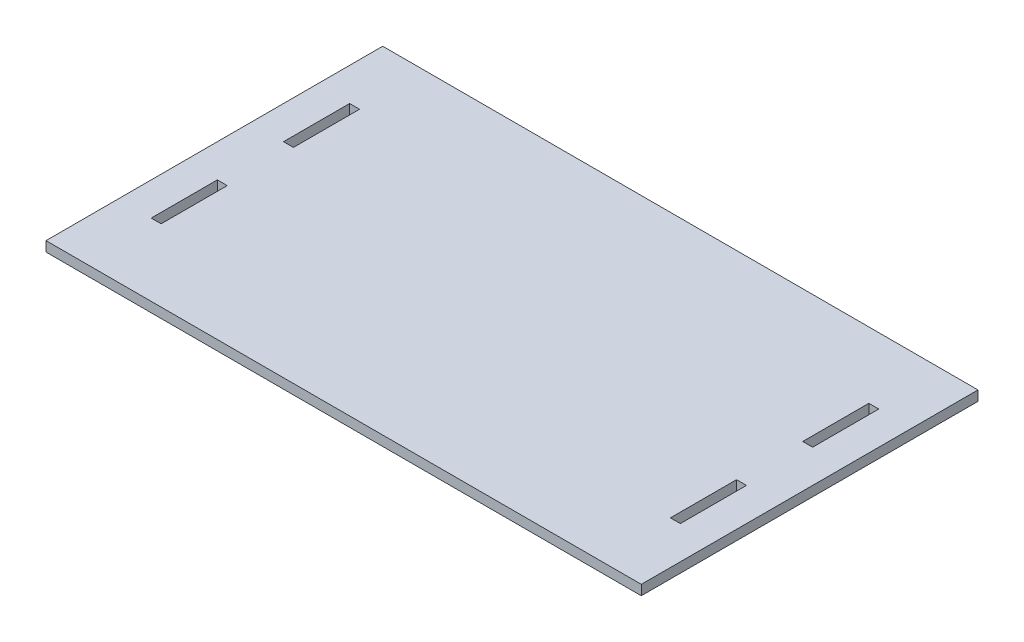
ISO-10303-21;
HEADER;
FILE_DESCRIPTION(('STEP AP214'),'2;1');
FILE_NAME('part.step','',(''),(''),'','','');
FILE_SCHEMA(('AUTOMOTIVE_DESIGN { 1 0 10303 214 1 1 1 1 }'));
ENDSEC;
DATA;
#1=APPLICATION_CONTEXT('core data for automotive mechanical design processes');
#2=APPLICATION_PROTOCOL_DEFINITION('international standard','automotive_design',2000,#1);
#3=PRODUCT_CONTEXT('',#1,'mechanical');
#4=PRODUCT('Part','Part','',(#3));
#5=PRODUCT_RELATED_PRODUCT_CATEGORY('part','',(#4));
#6=PRODUCT_DEFINITION_FORMATION('','',#4);
#7=PRODUCT_DEFINITION_CONTEXT('part definition',#1,'design');
#8=PRODUCT_DEFINITION('design','',#6,#7);
#9=PRODUCT_DEFINITION_SHAPE('','',#8);
#10=(LENGTH_UNIT() NAMED_UNIT(*) SI_UNIT(.MILLI.,.METRE.));
#11=(NAMED_UNIT(*) PLANE_ANGLE_UNIT() SI_UNIT($,.RADIAN.));
#12=(NAMED_UNIT(*) SI_UNIT($,.STERADIAN.) SOLID_ANGLE_UNIT());
#13=UNCERTAINTY_MEASURE_WITH_UNIT(LENGTH_MEASURE(1.E-05),#10,'distance_accuracy_value','');
#14=(GEOMETRIC_REPRESENTATION_CONTEXT(3) GLOBAL_UNCERTAINTY_ASSIGNED_CONTEXT((#13)) GLOBAL_UNIT_ASSIGNED_CONTEXT((#10,
#11,#12)) REPRESENTATION_CONTEXT('',''));
#15=CARTESIAN_POINT('',(0.,0.,0.));
#16=DIRECTION('',(0.,0.,1.));
#17=DIRECTION('',(1.,0.,0.));
#18=AXIS2_PLACEMENT_3D('',#15,#16,#17);
#19=CARTESIAN_POINT('',(0.,3.,0.));
#20=DIRECTION('',(1.,0.,0.));
#21=DIRECTION('',(0.,0.,-1.));
#22=AXIS2_PLACEMENT_3D('',#19,#20,#21);
#23=PLANE('',#22);
#24=DIRECTION('',(0.,0.,1.));
#25=VECTOR('',#24,1.);
#26=CARTESIAN_POINT('',(0.,0.,0.));
#27=LINE('',#26,#25);
#28=CARTESIAN_POINT('',(0.,0.,-101.81));
#29=VERTEX_POINT('',#28);
#30=CARTESIAN_POINT('',(0.,0.,0.));
#31=VERTEX_POINT('',#30);
#32=EDGE_CURVE('E298',#29,#31,#27,.T.);
#33=ORIENTED_EDGE('',*,*,#32,.T.);
#34=DIRECTION('',(0.,-1.,0.));
#35=VECTOR('',#34,1.);
#36=CARTESIAN_POINT('',(0.,3.,0.));
#37=LINE('',#36,#35);
#38=CARTESIAN_POINT('',(0.,3.,0.));
#39=VERTEX_POINT('',#38);
#40=EDGE_CURVE('E11',#39,#31,#37,.T.);
#41=ORIENTED_EDGE('',*,*,#40,.F.);
#42=DIRECTION('',(0.,0.,1.));
#43=VECTOR('',#42,1.);
#44=CARTESIAN_POINT('',(0.,3.,0.));
#45=LINE('',#44,#43);
#46=CARTESIAN_POINT('',(0.,3.,-101.81));
#47=VERTEX_POINT('',#46);
#48=EDGE_CURVE('E305',#47,#39,#45,.T.);
#49=ORIENTED_EDGE('',*,*,#48,.F.);
#50=DIRECTION('',(0.,-1.,0.));
#51=VECTOR('',#50,1.);
#52=CARTESIAN_POINT('',(0.,3.,-101.81));
#53=LINE('',#52,#51);
#54=EDGE_CURVE('E315',#47,#29,#53,.T.);
#55=ORIENTED_EDGE('',*,*,#54,.T.);
#56=EDGE_LOOP('',(#33,#41,#49,#55));
#57=FACE_BOUND('',#56,.T.);
#58=ADVANCED_FACE('F33',(#57),#23,.F.);
#59=CARTESIAN_POINT('',(0.,3.,0.));
#60=DIRECTION('',(0.,0.,-1.));
#61=DIRECTION('',(-1.,0.,0.));
#62=AXIS2_PLACEMENT_3D('',#59,#60,#61);
#63=PLANE('',#62);
#64=DIRECTION('',(1.,0.,0.));
#65=VECTOR('',#64,1.);
#66=CARTESIAN_POINT('',(0.,0.,0.));
#67=LINE('',#66,#65);
#68=CARTESIAN_POINT('',(180.,0.,0.));
#69=VERTEX_POINT('',#68);
#70=EDGE_CURVE('E318',#31,#69,#67,.T.);
#71=ORIENTED_EDGE('',*,*,#70,.T.);
#72=DIRECTION('',(0.,-1.,0.));
#73=VECTOR('',#72,1.);
#74=CARTESIAN_POINT('',(180.,3.,0.));
#75=LINE('',#74,#73);
#76=CARTESIAN_POINT('',(180.,3.,0.));
#77=VERTEX_POINT('',#76);
#78=EDGE_CURVE('E40',#77,#69,#75,.T.);
#79=ORIENTED_EDGE('',*,*,#78,.F.);
#80=DIRECTION('',(1.,0.,0.));
#81=VECTOR('',#80,1.);
#82=CARTESIAN_POINT('',(0.,3.,0.));
#83=LINE('',#82,#81);
#84=EDGE_CURVE('E308',#39,#77,#83,.T.);
#85=ORIENTED_EDGE('',*,*,#84,.F.);
#86=ORIENTED_EDGE('',*,*,#40,.T.);
#87=EDGE_LOOP('',(#71,#79,#85,#86));
#88=FACE_BOUND('',#87,.T.);
#89=ADVANCED_FACE('F347',(#88),#63,.F.);
#90=CARTESIAN_POINT('',(180.,3.,0.));
#91=DIRECTION('',(-1.,0.,0.));
#92=DIRECTION('',(0.,0.,1.));
#93=AXIS2_PLACEMENT_3D('',#90,#91,#92);
#94=PLANE('',#93);
#95=DIRECTION('',(0.,0.,-1.));
#96=VECTOR('',#95,1.);
#97=CARTESIAN_POINT('',(180.,0.,0.));
#98=LINE('',#97,#96);
#99=CARTESIAN_POINT('',(180.,0.,-101.81));
#100=VERTEX_POINT('',#99);
#101=EDGE_CURVE('E320',#69,#100,#98,.T.);
#102=ORIENTED_EDGE('',*,*,#101,.T.);
#103=DIRECTION('',(0.,-1.,0.));
#104=VECTOR('',#103,1.);
#105=CARTESIAN_POINT('',(180.,3.,-101.81));
#106=LINE('',#105,#104);
#107=CARTESIAN_POINT('',(180.,3.,-101.81));
#108=VERTEX_POINT('',#107);
#109=EDGE_CURVE('E325',#108,#100,#106,.T.);
#110=ORIENTED_EDGE('',*,*,#109,.F.);
#111=DIRECTION('',(0.,0.,-1.));
#112=VECTOR('',#111,1.);
#113=CARTESIAN_POINT('',(180.,3.,0.));
#114=LINE('',#113,#112);
#115=EDGE_CURVE('E311',#77,#108,#114,.T.);
#116=ORIENTED_EDGE('',*,*,#115,.F.);
#117=ORIENTED_EDGE('',*,*,#78,.T.);
#118=EDGE_LOOP('',(#102,#110,#116,#117));
#119=FACE_BOUND('',#118,.T.);
#120=ADVANCED_FACE('F332',(#119),#94,.F.);
#121=CARTESIAN_POINT('',(0.,3.,-101.81));
#122=DIRECTION('',(0.,0.,1.));
#123=DIRECTION('',(1.,0.,0.));
#124=AXIS2_PLACEMENT_3D('',#121,#122,#123);
#125=PLANE('',#124);
#126=DIRECTION('',(-1.,0.,0.));
#127=VECTOR('',#126,1.);
#128=CARTESIAN_POINT('',(0.,0.,-101.81));
#129=LINE('',#128,#127);
#130=EDGE_CURVE('E309',#100,#29,#129,.T.);
#131=ORIENTED_EDGE('',*,*,#130,.T.);
#132=ORIENTED_EDGE('',*,*,#54,.F.);
#133=DIRECTION('',(-1.,0.,0.));
#134=VECTOR('',#133,1.);
#135=CARTESIAN_POINT('',(0.,3.,-101.81));
#136=LINE('',#135,#134);
#137=EDGE_CURVE('E313',#108,#47,#136,.T.);
#138=ORIENTED_EDGE('',*,*,#137,.F.);
#139=ORIENTED_EDGE('',*,*,#109,.T.);
#140=EDGE_LOOP('',(#131,#132,#138,#139));
#141=FACE_BOUND('',#140,.T.);
#142=ADVANCED_FACE('F340',(#141),#125,.F.);
#143=CARTESIAN_POINT('',(0.,3.,0.));
#144=DIRECTION('',(0.,-1.,0.));
#145=DIRECTION('',(0.,0.,-1.));
#146=AXIS2_PLACEMENT_3D('',#143,#144,#145);
#147=PLANE('',#146);
#148=DIRECTION('',(1.,0.,0.));
#149=VECTOR('',#148,1.);
#150=CARTESIAN_POINT('',(9.99999999999979,3.,-21.8066157200849));
#151=LINE('',#150,#149);
#152=CARTESIAN_POINT('',(9.99999999999979,3.,-21.8066157200849));
#153=VERTEX_POINT('',#152);
#154=CARTESIAN_POINT('',(12.9999999999998,3.,-21.8066157200849));
#155=VERTEX_POINT('',#154);
#156=EDGE_CURVE('E227',#153,#155,#151,.T.);
#157=ORIENTED_EDGE('',*,*,#156,.F.);
#158=DIRECTION('',(0.,0.,1.));
#159=VECTOR('',#158,1.);
#160=CARTESIAN_POINT('',(9.99999999999979,3.,-41.8066157200849));
#161=LINE('',#160,#159);
#162=CARTESIAN_POINT('',(9.99999999999979,3.,-41.8066157200849));
#163=VERTEX_POINT('',#162);
#164=EDGE_CURVE('E47',#163,#153,#161,.T.);
#165=ORIENTED_EDGE('',*,*,#164,.F.);
#166=DIRECTION('',(-1.,0.,0.));
#167=VECTOR('',#166,1.);
#168=CARTESIAN_POINT('',(9.99999999999979,3.,-41.8066157200849));
#169=LINE('',#168,#167);
#170=CARTESIAN_POINT('',(12.9999999999998,3.,-41.8066157200849));
#171=VERTEX_POINT('',#170);
#172=EDGE_CURVE('E216',#171,#163,#169,.T.);
#173=ORIENTED_EDGE('',*,*,#172,.F.);
#174=DIRECTION('',(0.,0.,-1.));
#175=VECTOR('',#174,1.);
#176=CARTESIAN_POINT('',(12.9999999999998,3.,-41.8066157200849));
#177=LINE('',#176,#175);
#178=EDGE_CURVE('E231',#155,#171,#177,.T.);
#179=ORIENTED_EDGE('',*,*,#178,.F.);
#180=EDGE_LOOP('',(#157,#165,#173,#179));
#181=FACE_BOUND('',#180,.T.);
#182=DIRECTION('',(1.,0.,0.));
#183=VECTOR('',#182,1.);
#184=CARTESIAN_POINT('',(167.,3.,-61.8066157200849));
#185=LINE('',#184,#183);
#186=CARTESIAN_POINT('',(167.,3.,-61.8066157200849));
#187=VERTEX_POINT('',#186);
#188=CARTESIAN_POINT('',(170.,3.,-61.8066157200849));
#189=VERTEX_POINT('',#188);
#190=EDGE_CURVE('E259',#187,#189,#185,.T.);
#191=ORIENTED_EDGE('',*,*,#190,.F.);
#192=DIRECTION('',(0.,0.,1.));
#193=VECTOR('',#192,1.);
#194=CARTESIAN_POINT('',(167.,3.,-81.8066157200849));
#195=LINE('',#194,#193);
#196=CARTESIAN_POINT('',(167.,3.,-81.8066157200849));
#197=VERTEX_POINT('',#196);
#198=EDGE_CURVE('E55',#197,#187,#195,.T.);
#199=ORIENTED_EDGE('',*,*,#198,.F.);
#200=DIRECTION('',(-1.,0.,0.));
#201=VECTOR('',#200,1.);
#202=CARTESIAN_POINT('',(167.,3.,-81.8066157200849));
#203=LINE('',#202,#201);
#204=CARTESIAN_POINT('',(170.,3.,-81.8066157200849));
#205=VERTEX_POINT('',#204);
#206=EDGE_CURVE('E248',#205,#197,#203,.T.);
#207=ORIENTED_EDGE('',*,*,#206,.F.);
#208=DIRECTION('',(0.,0.,-1.));
#209=VECTOR('',#208,1.);
#210=CARTESIAN_POINT('',(170.,3.,-81.8066157200849));
#211=LINE('',#210,#209);
#212=EDGE_CURVE('E262',#189,#205,#211,.T.);
#213=ORIENTED_EDGE('',*,*,#212,.F.);
#214=EDGE_LOOP('',(#191,#199,#207,#213));
#215=FACE_BOUND('',#214,.T.);
#216=DIRECTION('',(1.,0.,0.));
#217=VECTOR('',#216,1.);
#218=CARTESIAN_POINT('',(167.,3.,-21.8066157200849));
#219=LINE('',#218,#217);
#220=CARTESIAN_POINT('',(167.,3.,-21.8066157200849));
#221=VERTEX_POINT('',#220);
#222=CARTESIAN_POINT('',(170.,3.,-21.8066157200849));
#223=VERTEX_POINT('',#222);
#224=EDGE_CURVE('E203',#221,#223,#219,.T.);
#225=ORIENTED_EDGE('',*,*,#224,.F.);
#226=DIRECTION('',(0.,0.,1.));
#227=VECTOR('',#226,1.);
#228=CARTESIAN_POINT('',(167.,3.,-41.8066157200849));
#229=LINE('',#228,#227);
#230=CARTESIAN_POINT('',(167.,3.,-41.8066157200849));
#231=VERTEX_POINT('',#230);
#232=EDGE_CURVE('E176',#231,#221,#229,.T.);
#233=ORIENTED_EDGE('',*,*,#232,.F.);
#234=DIRECTION('',(-1.,0.,0.));
#235=VECTOR('',#234,1.);
#236=CARTESIAN_POINT('',(167.,3.,-41.8066157200849));
#237=LINE('',#236,#235);
#238=CARTESIAN_POINT('',(170.,3.,-41.8066157200849));
#239=VERTEX_POINT('',#238);
#240=EDGE_CURVE('E194',#239,#231,#237,.T.);
#241=ORIENTED_EDGE('',*,*,#240,.F.);
#242=DIRECTION('',(0.,0.,-1.));
#243=VECTOR('',#242,1.);
#244=CARTESIAN_POINT('',(170.,3.,-41.8066157200849));
#245=LINE('',#244,#243);
#246=EDGE_CURVE('E197',#223,#239,#245,.T.);
#247=ORIENTED_EDGE('',*,*,#246,.F.);
#248=EDGE_LOOP('',(#225,#233,#241,#247));
#249=FACE_BOUND('',#248,.T.);
#250=DIRECTION('',(1.,0.,0.));
#251=VECTOR('',#250,1.);
#252=CARTESIAN_POINT('',(9.99999999999979,3.,-61.8066157200849));
#253=LINE('',#252,#251);
#254=CARTESIAN_POINT('',(9.99999999999979,3.,-61.8066157200849));
#255=VERTEX_POINT('',#254);
#256=CARTESIAN_POINT('',(12.9999999999998,3.,-61.8066157200849));
#257=VERTEX_POINT('',#256);
#258=EDGE_CURVE('E288',#255,#257,#253,.T.);
#259=ORIENTED_EDGE('',*,*,#258,.F.);
#260=DIRECTION('',(0.,0.,1.));
#261=VECTOR('',#260,1.);
#262=CARTESIAN_POINT('',(9.99999999999979,3.,-81.8066157200849));
#263=LINE('',#262,#261);
#264=CARTESIAN_POINT('',(9.99999999999979,3.,-81.8066157200849));
#265=VERTEX_POINT('',#264);
#266=EDGE_CURVE('E238',#265,#255,#263,.T.);
#267=ORIENTED_EDGE('',*,*,#266,.F.);
#268=DIRECTION('',(-1.,0.,0.));
#269=VECTOR('',#268,1.);
#270=CARTESIAN_POINT('',(9.99999999999979,3.,-81.8066157200849));
#271=LINE('',#270,#269);
#272=CARTESIAN_POINT('',(12.9999999999998,3.,-81.8066157200849));
#273=VERTEX_POINT('',#272);
#274=EDGE_CURVE('E277',#273,#265,#271,.T.);
#275=ORIENTED_EDGE('',*,*,#274,.F.);
#276=DIRECTION('',(0.,0.,-1.));
#277=VECTOR('',#276,1.);
#278=CARTESIAN_POINT('',(12.9999999999998,3.,-81.8066157200849));
#279=LINE('',#278,#277);
#280=EDGE_CURVE('E291',#257,#273,#279,.T.);
#281=ORIENTED_EDGE('',*,*,#280,.F.);
#282=EDGE_LOOP('',(#259,#267,#275,#281));
#283=FACE_BOUND('',#282,.T.);
#284=ORIENTED_EDGE('',*,*,#48,.T.);
#285=ORIENTED_EDGE('',*,*,#84,.T.);
#286=ORIENTED_EDGE('',*,*,#115,.T.);
#287=ORIENTED_EDGE('',*,*,#137,.T.);
#288=EDGE_LOOP('',(#284,#285,#286,#287));
#289=FACE_BOUND('',#288,.T.);
#290=ADVANCED_FACE('F346',(#181,#215,#249,#283,#289),#147,.F.);
#291=CARTESIAN_POINT('',(0.,0.,0.));
#292=DIRECTION('',(0.,-1.,0.));
#293=DIRECTION('',(0.,0.,-1.));
#294=AXIS2_PLACEMENT_3D('',#291,#292,#293);
#295=PLANE('',#294);
#296=DIRECTION('',(0.,0.,1.));
#297=VECTOR('',#296,1.);
#298=CARTESIAN_POINT('',(9.99999999999979,0.,-41.8066157200849));
#299=LINE('',#298,#297);
#300=CARTESIAN_POINT('',(9.99999999999979,0.,-41.8066157200849));
#301=VERTEX_POINT('',#300);
#302=CARTESIAN_POINT('',(9.99999999999979,0.,-21.8066157200849));
#303=VERTEX_POINT('',#302);
#304=EDGE_CURVE('E212',#301,#303,#299,.T.);
#305=ORIENTED_EDGE('',*,*,#304,.T.);
#306=DIRECTION('',(1.,0.,0.));
#307=VECTOR('',#306,1.);
#308=CARTESIAN_POINT('',(9.99999999999979,0.,-21.8066157200849));
#309=LINE('',#308,#307);
#310=CARTESIAN_POINT('',(12.9999999999998,0.,-21.8066157200849));
#311=VERTEX_POINT('',#310);
#312=EDGE_CURVE('E215',#303,#311,#309,.T.);
#313=ORIENTED_EDGE('',*,*,#312,.T.);
#314=DIRECTION('',(0.,0.,-1.));
#315=VECTOR('',#314,1.);
#316=CARTESIAN_POINT('',(12.9999999999998,0.,-41.8066157200849));
#317=LINE('',#316,#315);
#318=CARTESIAN_POINT('',(12.9999999999998,0.,-41.8066157200849));
#319=VERTEX_POINT('',#318);
#320=EDGE_CURVE('E219',#311,#319,#317,.T.);
#321=ORIENTED_EDGE('',*,*,#320,.T.);
#322=DIRECTION('',(-1.,0.,0.));
#323=VECTOR('',#322,1.);
#324=CARTESIAN_POINT('',(9.99999999999979,0.,-41.8066157200849));
#325=LINE('',#324,#323);
#326=EDGE_CURVE('E222',#319,#301,#325,.T.);
#327=ORIENTED_EDGE('',*,*,#326,.T.);
#328=EDGE_LOOP('',(#305,#313,#321,#327));
#329=FACE_BOUND('',#328,.T.);
#330=DIRECTION('',(0.,0.,1.));
#331=VECTOR('',#330,1.);
#332=CARTESIAN_POINT('',(167.,0.,-81.8066157200849));
#333=LINE('',#332,#331);
#334=CARTESIAN_POINT('',(167.,0.,-81.8066157200849));
#335=VERTEX_POINT('',#334);
#336=CARTESIAN_POINT('',(167.,0.,-61.8066157200849));
#337=VERTEX_POINT('',#336);
#338=EDGE_CURVE('E244',#335,#337,#333,.T.);
#339=ORIENTED_EDGE('',*,*,#338,.T.);
#340=DIRECTION('',(1.,0.,0.));
#341=VECTOR('',#340,1.);
#342=CARTESIAN_POINT('',(167.,0.,-61.8066157200849));
#343=LINE('',#342,#341);
#344=CARTESIAN_POINT('',(170.,0.,-61.8066157200849));
#345=VERTEX_POINT('',#344);
#346=EDGE_CURVE('E247',#337,#345,#343,.T.);
#347=ORIENTED_EDGE('',*,*,#346,.T.);
#348=DIRECTION('',(0.,0.,-1.));
#349=VECTOR('',#348,1.);
#350=CARTESIAN_POINT('',(170.,0.,-81.8066157200849));
#351=LINE('',#350,#349);
#352=CARTESIAN_POINT('',(170.,0.,-81.8066157200849));
#353=VERTEX_POINT('',#352);
#354=EDGE_CURVE('E251',#345,#353,#351,.T.);
#355=ORIENTED_EDGE('',*,*,#354,.T.);
#356=DIRECTION('',(-1.,0.,0.));
#357=VECTOR('',#356,1.);
#358=CARTESIAN_POINT('',(167.,0.,-81.8066157200849));
#359=LINE('',#358,#357);
#360=EDGE_CURVE('E254',#353,#335,#359,.T.);
#361=ORIENTED_EDGE('',*,*,#360,.T.);
#362=EDGE_LOOP('',(#339,#347,#355,#361));
#363=FACE_BOUND('',#362,.T.);
#364=DIRECTION('',(0.,0.,1.));
#365=VECTOR('',#364,1.);
#366=CARTESIAN_POINT('',(167.,0.,-41.8066157200849));
#367=LINE('',#366,#365);
#368=CARTESIAN_POINT('',(167.,0.,-41.8066157200849));
#369=VERTEX_POINT('',#368);
#370=CARTESIAN_POINT('',(167.,0.,-21.8066157200849));
#371=VERTEX_POINT('',#370);
#372=EDGE_CURVE('E173',#369,#371,#367,.T.);
#373=ORIENTED_EDGE('',*,*,#372,.T.);
#374=DIRECTION('',(1.,0.,0.));
#375=VECTOR('',#374,1.);
#376=CARTESIAN_POINT('',(167.,0.,-21.8066157200849));
#377=LINE('',#376,#375);
#378=CARTESIAN_POINT('',(170.,0.,-21.8066157200849));
#379=VERTEX_POINT('',#378);
#380=EDGE_CURVE('E185',#371,#379,#377,.T.);
#381=ORIENTED_EDGE('',*,*,#380,.T.);
#382=DIRECTION('',(0.,0.,-1.));
#383=VECTOR('',#382,1.);
#384=CARTESIAN_POINT('',(170.,0.,-41.8066157200849));
#385=LINE('',#384,#383);
#386=CARTESIAN_POINT('',(170.,0.,-41.8066157200849));
#387=VERTEX_POINT('',#386);
#388=EDGE_CURVE('E189',#379,#387,#385,.T.);
#389=ORIENTED_EDGE('',*,*,#388,.T.);
#390=DIRECTION('',(-1.,0.,0.));
#391=VECTOR('',#390,1.);
#392=CARTESIAN_POINT('',(167.,0.,-41.8066157200849));
#393=LINE('',#392,#391);
#394=EDGE_CURVE('E181',#387,#369,#393,.T.);
#395=ORIENTED_EDGE('',*,*,#394,.T.);
#396=EDGE_LOOP('',(#373,#381,#389,#395));
#397=FACE_BOUND('',#396,.T.);
#398=DIRECTION('',(0.,0.,1.));
#399=VECTOR('',#398,1.);
#400=CARTESIAN_POINT('',(9.99999999999979,0.,-81.8066157200849));
#401=LINE('',#400,#399);
#402=CARTESIAN_POINT('',(9.99999999999979,0.,-81.8066157200849));
#403=VERTEX_POINT('',#402);
#404=CARTESIAN_POINT('',(9.99999999999979,0.,-61.8066157200849));
#405=VERTEX_POINT('',#404);
#406=EDGE_CURVE('E273',#403,#405,#401,.T.);
#407=ORIENTED_EDGE('',*,*,#406,.T.);
#408=DIRECTION('',(1.,0.,0.));
#409=VECTOR('',#408,1.);
#410=CARTESIAN_POINT('',(9.99999999999979,0.,-61.8066157200849));
#411=LINE('',#410,#409);
#412=CARTESIAN_POINT('',(12.9999999999998,0.,-61.8066157200849));
#413=VERTEX_POINT('',#412);
#414=EDGE_CURVE('E276',#405,#413,#411,.T.);
#415=ORIENTED_EDGE('',*,*,#414,.T.);
#416=DIRECTION('',(0.,0.,-1.));
#417=VECTOR('',#416,1.);
#418=CARTESIAN_POINT('',(12.9999999999998,0.,-81.8066157200849));
#419=LINE('',#418,#417);
#420=CARTESIAN_POINT('',(12.9999999999998,0.,-81.8066157200849));
#421=VERTEX_POINT('',#420);
#422=EDGE_CURVE('E280',#413,#421,#419,.T.);
#423=ORIENTED_EDGE('',*,*,#422,.T.);
#424=DIRECTION('',(-1.,0.,0.));
#425=VECTOR('',#424,1.);
#426=CARTESIAN_POINT('',(9.99999999999979,0.,-81.8066157200849));
#427=LINE('',#426,#425);
#428=EDGE_CURVE('E283',#421,#403,#427,.T.);
#429=ORIENTED_EDGE('',*,*,#428,.T.);
#430=EDGE_LOOP('',(#407,#415,#423,#429));
#431=FACE_BOUND('',#430,.T.);
#432=ORIENTED_EDGE('',*,*,#32,.F.);
#433=ORIENTED_EDGE('',*,*,#130,.F.);
#434=ORIENTED_EDGE('',*,*,#101,.F.);
#435=ORIENTED_EDGE('',*,*,#70,.F.);
#436=EDGE_LOOP('',(#432,#433,#434,#435));
#437=FACE_BOUND('',#436,.T.);
#438=ADVANCED_FACE('F191',(#329,#363,#397,#431,#437),#295,.T.);
#439=CARTESIAN_POINT('',(9.99999999999979,0.,-81.8066157200849));
#440=DIRECTION('',(-1.,0.,0.));
#441=DIRECTION('',(0.,0.,1.));
#442=AXIS2_PLACEMENT_3D('',#439,#440,#441);
#443=PLANE('',#442);
#444=ORIENTED_EDGE('',*,*,#266,.T.);
#445=DIRECTION('',(0.,1.,0.));
#446=VECTOR('',#445,1.);
#447=CARTESIAN_POINT('',(9.99999999999979,0.,-61.8066157200849));
#448=LINE('',#447,#446);
#449=EDGE_CURVE('E286',#405,#255,#448,.T.);
#450=ORIENTED_EDGE('',*,*,#449,.F.);
#451=ORIENTED_EDGE('',*,*,#406,.F.);
#452=DIRECTION('',(0.,1.,0.));
#453=VECTOR('',#452,1.);
#454=CARTESIAN_POINT('',(9.99999999999979,0.,-81.8066157200849));
#455=LINE('',#454,#453);
#456=EDGE_CURVE('E296',#403,#265,#455,.T.);
#457=ORIENTED_EDGE('',*,*,#456,.T.);
#458=EDGE_LOOP('',(#444,#450,#451,#457));
#459=FACE_BOUND('',#458,.T.);
#460=ADVANCED_FACE('F359',(#459),#443,.F.);
#461=CARTESIAN_POINT('',(9.99999999999979,0.,-81.8066157200849));
#462=DIRECTION('',(0.,0.,-1.));
#463=DIRECTION('',(-1.,0.,0.));
#464=AXIS2_PLACEMENT_3D('',#461,#462,#463);
#465=PLANE('',#464);
#466=ORIENTED_EDGE('',*,*,#274,.T.);
#467=ORIENTED_EDGE('',*,*,#456,.F.);
#468=ORIENTED_EDGE('',*,*,#428,.F.);
#469=DIRECTION('',(0.,1.,0.));
#470=VECTOR('',#469,1.);
#471=CARTESIAN_POINT('',(12.9999999999998,0.,-81.8066157200849));
#472=LINE('',#471,#470);
#473=EDGE_CURVE('E299',#421,#273,#472,.T.);
#474=ORIENTED_EDGE('',*,*,#473,.T.);
#475=EDGE_LOOP('',(#466,#467,#468,#474));
#476=FACE_BOUND('',#475,.T.);
#477=ADVANCED_FACE('F366',(#476),#465,.F.);
#478=CARTESIAN_POINT('',(12.9999999999998,0.,-81.8066157200849));
#479=DIRECTION('',(1.,0.,0.));
#480=DIRECTION('',(0.,0.,-1.));
#481=AXIS2_PLACEMENT_3D('',#478,#479,#480);
#482=PLANE('',#481);
#483=ORIENTED_EDGE('',*,*,#280,.T.);
#484=ORIENTED_EDGE('',*,*,#473,.F.);
#485=ORIENTED_EDGE('',*,*,#422,.F.);
#486=DIRECTION('',(0.,1.,0.));
#487=VECTOR('',#486,1.);
#488=CARTESIAN_POINT('',(12.9999999999998,0.,-61.8066157200849));
#489=LINE('',#488,#487);
#490=EDGE_CURVE('E301',#413,#257,#489,.T.);
#491=ORIENTED_EDGE('',*,*,#490,.T.);
#492=EDGE_LOOP('',(#483,#484,#485,#491));
#493=FACE_BOUND('',#492,.T.);
#494=ADVANCED_FACE('F371',(#493),#482,.F.);
#495=CARTESIAN_POINT('',(9.99999999999979,0.,-61.8066157200849));
#496=DIRECTION('',(0.,0.,1.));
#497=DIRECTION('',(1.,0.,0.));
#498=AXIS2_PLACEMENT_3D('',#495,#496,#497);
#499=PLANE('',#498);
#500=ORIENTED_EDGE('',*,*,#258,.T.);
#501=ORIENTED_EDGE('',*,*,#490,.F.);
#502=ORIENTED_EDGE('',*,*,#414,.F.);
#503=ORIENTED_EDGE('',*,*,#449,.T.);
#504=EDGE_LOOP('',(#500,#501,#502,#503));
#505=FACE_BOUND('',#504,.T.);
#506=ADVANCED_FACE('F368',(#505),#499,.F.);
#507=CARTESIAN_POINT('',(167.,0.,-41.8066157200849));
#508=DIRECTION('',(-1.,0.,0.));
#509=DIRECTION('',(0.,0.,1.));
#510=AXIS2_PLACEMENT_3D('',#507,#508,#509);
#511=PLANE('',#510);
#512=ORIENTED_EDGE('',*,*,#232,.T.);
#513=DIRECTION('',(0.,1.,0.));
#514=VECTOR('',#513,1.);
#515=CARTESIAN_POINT('',(167.,0.,-21.8066157200849));
#516=LINE('',#515,#514);
#517=EDGE_CURVE('E169',#371,#221,#516,.T.);
#518=ORIENTED_EDGE('',*,*,#517,.F.);
#519=ORIENTED_EDGE('',*,*,#372,.F.);
#520=DIRECTION('',(0.,1.,0.));
#521=VECTOR('',#520,1.);
#522=CARTESIAN_POINT('',(167.,0.,-41.8066157200849));
#523=LINE('',#522,#521);
#524=EDGE_CURVE('E207',#369,#231,#523,.T.);
#525=ORIENTED_EDGE('',*,*,#524,.T.);
#526=EDGE_LOOP('',(#512,#518,#519,#525));
#527=FACE_BOUND('',#526,.T.);
#528=ADVANCED_FACE('F171',(#527),#511,.F.);
#529=CARTESIAN_POINT('',(167.,0.,-41.8066157200849));
#530=DIRECTION('',(0.,0.,-1.));
#531=DIRECTION('',(-1.,0.,0.));
#532=AXIS2_PLACEMENT_3D('',#529,#530,#531);
#533=PLANE('',#532);
#534=ORIENTED_EDGE('',*,*,#240,.T.);
#535=ORIENTED_EDGE('',*,*,#524,.F.);
#536=ORIENTED_EDGE('',*,*,#394,.F.);
#537=DIRECTION('',(0.,1.,0.));
#538=VECTOR('',#537,1.);
#539=CARTESIAN_POINT('',(170.,0.,-41.8066157200849));
#540=LINE('',#539,#538);
#541=EDGE_CURVE('E209',#387,#239,#540,.T.);
#542=ORIENTED_EDGE('',*,*,#541,.T.);
#543=EDGE_LOOP('',(#534,#535,#536,#542));
#544=FACE_BOUND('',#543,.T.);
#545=ADVANCED_FACE('F411',(#544),#533,.F.);
#546=CARTESIAN_POINT('',(170.,0.,-41.8066157200849));
#547=DIRECTION('',(1.,0.,0.));
#548=DIRECTION('',(0.,0.,-1.));
#549=AXIS2_PLACEMENT_3D('',#546,#547,#548);
#550=PLANE('',#549);
#551=ORIENTED_EDGE('',*,*,#246,.T.);
#552=ORIENTED_EDGE('',*,*,#541,.F.);
#553=ORIENTED_EDGE('',*,*,#388,.F.);
#554=DIRECTION('',(0.,1.,0.));
#555=VECTOR('',#554,1.);
#556=CARTESIAN_POINT('',(170.,0.,-21.8066157200849));
#557=LINE('',#556,#555);
#558=EDGE_CURVE('E180',#379,#223,#557,.T.);
#559=ORIENTED_EDGE('',*,*,#558,.T.);
#560=EDGE_LOOP('',(#551,#552,#553,#559));
#561=FACE_BOUND('',#560,.T.);
#562=ADVANCED_FACE('F414',(#561),#550,.F.);
#563=CARTESIAN_POINT('',(167.,0.,-21.8066157200849));
#564=DIRECTION('',(0.,0.,1.));
#565=DIRECTION('',(1.,0.,0.));
#566=AXIS2_PLACEMENT_3D('',#563,#564,#565);
#567=PLANE('',#566);
#568=ORIENTED_EDGE('',*,*,#224,.T.);
#569=ORIENTED_EDGE('',*,*,#558,.F.);
#570=ORIENTED_EDGE('',*,*,#380,.F.);
#571=ORIENTED_EDGE('',*,*,#517,.T.);
#572=EDGE_LOOP('',(#568,#569,#570,#571));
#573=FACE_BOUND('',#572,.T.);
#574=ADVANCED_FACE('F186',(#573),#567,.F.);
#575=CARTESIAN_POINT('',(167.,0.,-81.8066157200849));
#576=DIRECTION('',(-1.,0.,0.));
#577=DIRECTION('',(0.,0.,1.));
#578=AXIS2_PLACEMENT_3D('',#575,#576,#577);
#579=PLANE('',#578);
#580=ORIENTED_EDGE('',*,*,#198,.T.);
#581=DIRECTION('',(0.,1.,0.));
#582=VECTOR('',#581,1.);
#583=CARTESIAN_POINT('',(167.,0.,-61.8066157200849));
#584=LINE('',#583,#582);
#585=EDGE_CURVE('E257',#337,#187,#584,.T.);
#586=ORIENTED_EDGE('',*,*,#585,.F.);
#587=ORIENTED_EDGE('',*,*,#338,.F.);
#588=DIRECTION('',(0.,1.,0.));
#589=VECTOR('',#588,1.);
#590=CARTESIAN_POINT('',(167.,0.,-81.8066157200849));
#591=LINE('',#590,#589);
#592=EDGE_CURVE('E228',#335,#197,#591,.T.);
#593=ORIENTED_EDGE('',*,*,#592,.T.);
#594=EDGE_LOOP('',(#580,#586,#587,#593));
#595=FACE_BOUND('',#594,.T.);
#596=ADVANCED_FACE('F379',(#595),#579,.F.);
#597=CARTESIAN_POINT('',(167.,0.,-81.8066157200849));
#598=DIRECTION('',(0.,0.,-1.));
#599=DIRECTION('',(-1.,0.,0.));
#600=AXIS2_PLACEMENT_3D('',#597,#598,#599);
#601=PLANE('',#600);
#602=ORIENTED_EDGE('',*,*,#206,.T.);
#603=ORIENTED_EDGE('',*,*,#592,.F.);
#604=ORIENTED_EDGE('',*,*,#360,.F.);
#605=DIRECTION('',(0.,1.,0.));
#606=VECTOR('',#605,1.);
#607=CARTESIAN_POINT('',(170.,0.,-81.8066157200849));
#608=LINE('',#607,#606);
#609=EDGE_CURVE('E268',#353,#205,#608,.T.);
#610=ORIENTED_EDGE('',*,*,#609,.T.);
#611=EDGE_LOOP('',(#602,#603,#604,#610));
#612=FACE_BOUND('',#611,.T.);
#613=ADVANCED_FACE('F382',(#612),#601,.F.);
#614=CARTESIAN_POINT('',(170.,0.,-81.8066157200849));
#615=DIRECTION('',(1.,0.,0.));
#616=DIRECTION('',(0.,0.,-1.));
#617=AXIS2_PLACEMENT_3D('',#614,#615,#616);
#618=PLANE('',#617);
#619=ORIENTED_EDGE('',*,*,#212,.T.);
#620=ORIENTED_EDGE('',*,*,#609,.F.);
#621=ORIENTED_EDGE('',*,*,#354,.F.);
#622=DIRECTION('',(0.,1.,0.));
#623=VECTOR('',#622,1.);
#624=CARTESIAN_POINT('',(170.,0.,-61.8066157200849));
#625=LINE('',#624,#623);
#626=EDGE_CURVE('E270',#345,#189,#625,.T.);
#627=ORIENTED_EDGE('',*,*,#626,.T.);
#628=EDGE_LOOP('',(#619,#620,#621,#627));
#629=FACE_BOUND('',#628,.T.);
#630=ADVANCED_FACE('F387',(#629),#618,.F.);
#631=CARTESIAN_POINT('',(167.,0.,-61.8066157200849));
#632=DIRECTION('',(0.,0.,1.));
#633=DIRECTION('',(1.,0.,0.));
#634=AXIS2_PLACEMENT_3D('',#631,#632,#633);
#635=PLANE('',#634);
#636=ORIENTED_EDGE('',*,*,#190,.T.);
#637=ORIENTED_EDGE('',*,*,#626,.F.);
#638=ORIENTED_EDGE('',*,*,#346,.F.);
#639=ORIENTED_EDGE('',*,*,#585,.T.);
#640=EDGE_LOOP('',(#636,#637,#638,#639));
#641=FACE_BOUND('',#640,.T.);
#642=ADVANCED_FACE('F383',(#641),#635,.F.);
#643=CARTESIAN_POINT('',(9.99999999999979,0.,-41.8066157200849));
#644=DIRECTION('',(-1.,0.,0.));
#645=DIRECTION('',(0.,0.,1.));
#646=AXIS2_PLACEMENT_3D('',#643,#644,#645);
#647=PLANE('',#646);
#648=ORIENTED_EDGE('',*,*,#164,.T.);
#649=DIRECTION('',(0.,1.,0.));
#650=VECTOR('',#649,1.);
#651=CARTESIAN_POINT('',(9.99999999999979,0.,-21.8066157200849));
#652=LINE('',#651,#650);
#653=EDGE_CURVE('E225',#303,#153,#652,.T.);
#654=ORIENTED_EDGE('',*,*,#653,.F.);
#655=ORIENTED_EDGE('',*,*,#304,.F.);
#656=DIRECTION('',(0.,1.,0.));
#657=VECTOR('',#656,1.);
#658=CARTESIAN_POINT('',(9.99999999999979,0.,-41.8066157200849));
#659=LINE('',#658,#657);
#660=EDGE_CURVE('E236',#301,#163,#659,.T.);
#661=ORIENTED_EDGE('',*,*,#660,.T.);
#662=EDGE_LOOP('',(#648,#654,#655,#661));
#663=FACE_BOUND('',#662,.T.);
#664=ADVANCED_FACE('F386',(#663),#647,.F.);
#665=CARTESIAN_POINT('',(9.99999999999979,0.,-41.8066157200849));
#666=DIRECTION('',(0.,0.,-1.));
#667=DIRECTION('',(-1.,0.,0.));
#668=AXIS2_PLACEMENT_3D('',#665,#666,#667);
#669=PLANE('',#668);
#670=ORIENTED_EDGE('',*,*,#172,.T.);
#671=ORIENTED_EDGE('',*,*,#660,.F.);
#672=ORIENTED_EDGE('',*,*,#326,.F.);
#673=DIRECTION('',(0.,1.,0.));
#674=VECTOR('',#673,1.);
#675=CARTESIAN_POINT('',(12.9999999999998,0.,-41.8066157200849));
#676=LINE('',#675,#674);
#677=EDGE_CURVE('E239',#319,#171,#676,.T.);
#678=ORIENTED_EDGE('',*,*,#677,.T.);
#679=EDGE_LOOP('',(#670,#671,#672,#678));
#680=FACE_BOUND('',#679,.T.);
#681=ADVANCED_FACE('F397',(#680),#669,.F.);
#682=CARTESIAN_POINT('',(12.9999999999998,0.,-41.8066157200849));
#683=DIRECTION('',(1.,0.,0.));
#684=DIRECTION('',(0.,0.,-1.));
#685=AXIS2_PLACEMENT_3D('',#682,#683,#684);
#686=PLANE('',#685);
#687=ORIENTED_EDGE('',*,*,#178,.T.);
#688=ORIENTED_EDGE('',*,*,#677,.F.);
#689=ORIENTED_EDGE('',*,*,#320,.F.);
#690=DIRECTION('',(0.,1.,0.));
#691=VECTOR('',#690,1.);
#692=CARTESIAN_POINT('',(12.9999999999998,0.,-21.8066157200849));
#693=LINE('',#692,#691);
#694=EDGE_CURVE('E241',#311,#155,#693,.T.);
#695=ORIENTED_EDGE('',*,*,#694,.T.);
#696=EDGE_LOOP('',(#687,#688,#689,#695));
#697=FACE_BOUND('',#696,.T.);
#698=ADVANCED_FACE('F401',(#697),#686,.F.);
#699=CARTESIAN_POINT('',(9.99999999999979,0.,-21.8066157200849));
#700=DIRECTION('',(0.,0.,1.));
#701=DIRECTION('',(1.,0.,0.));
#702=AXIS2_PLACEMENT_3D('',#699,#700,#701);
#703=PLANE('',#702);
#704=ORIENTED_EDGE('',*,*,#156,.T.);
#705=ORIENTED_EDGE('',*,*,#694,.F.);
#706=ORIENTED_EDGE('',*,*,#312,.F.);
#707=ORIENTED_EDGE('',*,*,#653,.T.);
#708=EDGE_LOOP('',(#704,#705,#706,#707));
#709=FACE_BOUND('',#708,.T.);
#710=ADVANCED_FACE('F398',(#709),#703,.F.);
#711=CLOSED_SHELL('',(#58,#89,#120,#142,#290,#438,#460,#477,#494,#506,#528,#545,#562,#574,#596,
#613,#630,#642,#664,#681,#698,#710));
#712=MANIFOLD_SOLID_BREP('B2',#711);
#713=ADVANCED_BREP_SHAPE_REPRESENTATION('',(#18,#712),#14);
#714=SHAPE_DEFINITION_REPRESENTATION(#9,#713);
ENDSEC;
END-ISO-10303-21;
